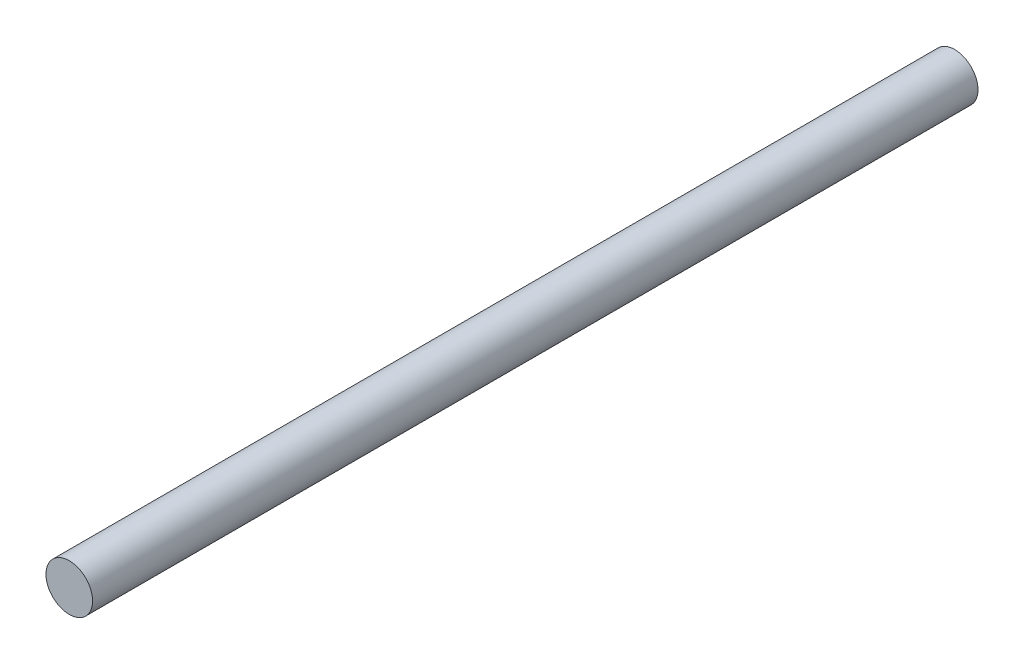
ISO-10303-21;
HEADER;
FILE_DESCRIPTION(('STEP AP214'),'2;1');
FILE_NAME('part.step','',(''),(''),'','','');
FILE_SCHEMA(('AUTOMOTIVE_DESIGN { 1 0 10303 214 1 1 1 1 }'));
ENDSEC;
DATA;
#1=APPLICATION_CONTEXT('core data for automotive mechanical design processes');
#2=APPLICATION_PROTOCOL_DEFINITION('international standard','automotive_design',2000,#1);
#3=PRODUCT_CONTEXT('',#1,'mechanical');
#4=PRODUCT('Part','Part','',(#3));
#5=PRODUCT_RELATED_PRODUCT_CATEGORY('part','',(#4));
#6=PRODUCT_DEFINITION_FORMATION('','',#4);
#7=PRODUCT_DEFINITION_CONTEXT('part definition',#1,'design');
#8=PRODUCT_DEFINITION('design','',#6,#7);
#9=PRODUCT_DEFINITION_SHAPE('','',#8);
#10=(LENGTH_UNIT() NAMED_UNIT(*) SI_UNIT(.MILLI.,.METRE.));
#11=(NAMED_UNIT(*) PLANE_ANGLE_UNIT() SI_UNIT($,.RADIAN.));
#12=(NAMED_UNIT(*) SI_UNIT($,.STERADIAN.) SOLID_ANGLE_UNIT());
#13=UNCERTAINTY_MEASURE_WITH_UNIT(LENGTH_MEASURE(1.E-05),#10,'distance_accuracy_value','');
#14=(GEOMETRIC_REPRESENTATION_CONTEXT(3) GLOBAL_UNCERTAINTY_ASSIGNED_CONTEXT((#13)) GLOBAL_UNIT_ASSIGNED_CONTEXT((#10,
#11,#12)) REPRESENTATION_CONTEXT('',''));
#15=CARTESIAN_POINT('',(0.,0.,0.));
#16=DIRECTION('',(0.,0.,1.));
#17=DIRECTION('',(1.,0.,0.));
#18=AXIS2_PLACEMENT_3D('',#15,#16,#17);
#19=CARTESIAN_POINT('',(0.,0.,190.));
#20=DIRECTION('',(0.,0.,-1.));
#21=DIRECTION('',(-1.,0.,0.));
#22=AXIS2_PLACEMENT_3D('',#19,#20,#21);
#23=CYLINDRICAL_SURFACE('',#22,5.);
#24=CARTESIAN_POINT('',(0.,0.,190.));
#25=DIRECTION('',(0.,0.,1.));
#26=DIRECTION('',(1.,0.,0.));
#27=AXIS2_PLACEMENT_3D('',#24,#25,#26);
#28=CIRCLE('',#27,5.);
#29=CARTESIAN_POINT('',(5.,0.,190.));
#30=VERTEX_POINT('',#29);
#31=EDGE_CURVE('E10',#30,#30,#28,.T.);
#32=ORIENTED_EDGE('',*,*,#31,.F.);
#33=EDGE_LOOP('',(#32));
#34=FACE_BOUND('',#33,.T.);
#35=CARTESIAN_POINT('',(0.,0.,0.));
#36=DIRECTION('',(0.,0.,1.));
#37=DIRECTION('',(1.,0.,0.));
#38=AXIS2_PLACEMENT_3D('',#35,#36,#37);
#39=CIRCLE('',#38,5.);
#40=CARTESIAN_POINT('',(5.,0.,0.));
#41=VERTEX_POINT('',#40);
#42=EDGE_CURVE('E40',#41,#41,#39,.T.);
#43=ORIENTED_EDGE('',*,*,#42,.T.);
#44=EDGE_LOOP('',(#43));
#45=FACE_BOUND('',#44,.T.);
#46=ADVANCED_FACE('F37',(#34,#45),#23,.T.);
#47=CARTESIAN_POINT('',(0.,0.,190.));
#48=DIRECTION('',(0.,0.,1.));
#49=DIRECTION('',(1.,0.,0.));
#50=AXIS2_PLACEMENT_3D('',#47,#48,#49);
#51=PLANE('',#50);
#52=ORIENTED_EDGE('',*,*,#31,.T.);
#53=EDGE_LOOP('',(#52));
#54=FACE_BOUND('',#53,.T.);
#55=ADVANCED_FACE('F54',(#54),#51,.T.);
#56=CARTESIAN_POINT('',(0.,0.,0.));
#57=DIRECTION('',(0.,0.,1.));
#58=DIRECTION('',(1.,0.,0.));
#59=AXIS2_PLACEMENT_3D('',#56,#57,#58);
#60=PLANE('',#59);
#61=ORIENTED_EDGE('',*,*,#42,.F.);
#62=EDGE_LOOP('',(#61));
#63=FACE_BOUND('',#62,.T.);
#64=ADVANCED_FACE('F52',(#63),#60,.F.);
#65=CLOSED_SHELL('',(#46,#55,#64));
#66=MANIFOLD_SOLID_BREP('B2',#65);
#67=ADVANCED_BREP_SHAPE_REPRESENTATION('',(#18,#66),#14);
#68=SHAPE_DEFINITION_REPRESENTATION(#9,#67);
ENDSEC;
END-ISO-10303-21;
